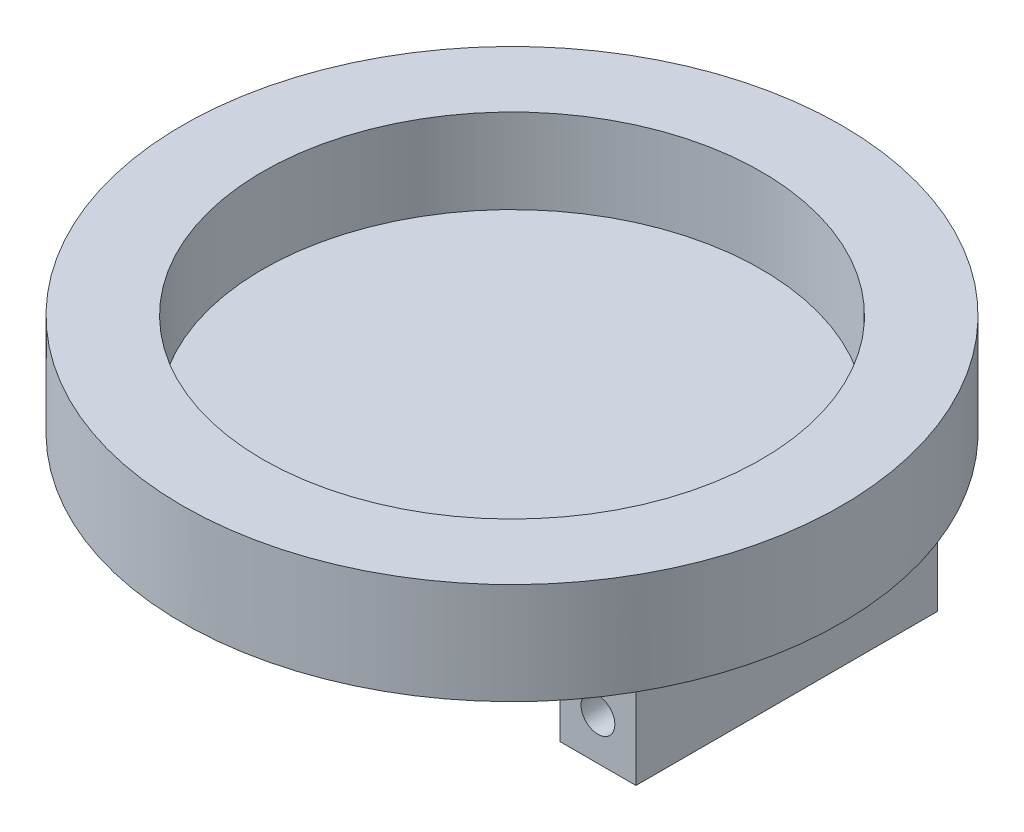
ISO-10303-21;
HEADER;
FILE_DESCRIPTION(('STEP AP214'),'2;1');
FILE_NAME('part.step','',(''),(''),'','','');
FILE_SCHEMA(('AUTOMOTIVE_DESIGN { 1 0 10303 214 1 1 1 1 }'));
ENDSEC;
DATA;
#1=APPLICATION_CONTEXT('core data for automotive mechanical design processes');
#2=APPLICATION_PROTOCOL_DEFINITION('international standard','automotive_design',2000,#1);
#3=PRODUCT_CONTEXT('',#1,'mechanical');
#4=PRODUCT('Part','Part','',(#3));
#5=PRODUCT_RELATED_PRODUCT_CATEGORY('part','',(#4));
#6=PRODUCT_DEFINITION_FORMATION('','',#4);
#7=PRODUCT_DEFINITION_CONTEXT('part definition',#1,'design');
#8=PRODUCT_DEFINITION('design','',#6,#7);
#9=PRODUCT_DEFINITION_SHAPE('','',#8);
#10=(LENGTH_UNIT() NAMED_UNIT(*) SI_UNIT(.MILLI.,.METRE.));
#11=(NAMED_UNIT(*) PLANE_ANGLE_UNIT() SI_UNIT($,.RADIAN.));
#12=(NAMED_UNIT(*) SI_UNIT($,.STERADIAN.) SOLID_ANGLE_UNIT());
#13=UNCERTAINTY_MEASURE_WITH_UNIT(LENGTH_MEASURE(1.E-05),#10,'distance_accuracy_value','');
#14=(GEOMETRIC_REPRESENTATION_CONTEXT(3) GLOBAL_UNCERTAINTY_ASSIGNED_CONTEXT((#13)) GLOBAL_UNIT_ASSIGNED_CONTEXT((#10,
#11,#12)) REPRESENTATION_CONTEXT('',''));
#15=CARTESIAN_POINT('',(0.,0.,0.));
#16=DIRECTION('',(0.,0.,1.));
#17=DIRECTION('',(1.,0.,0.));
#18=AXIS2_PLACEMENT_3D('',#15,#16,#17);
#19=CARTESIAN_POINT('',(0.,63.5,0.));
#20=DIRECTION('',(0.,1.,0.));
#21=DIRECTION('',(0.,0.,1.));
#22=AXIS2_PLACEMENT_3D('',#19,#20,#21);
#23=PLANE('',#22);
#24=CARTESIAN_POINT('',(0.,63.5,0.));
#25=DIRECTION('',(0.,1.,0.));
#26=DIRECTION('',(0.,0.,1.));
#27=AXIS2_PLACEMENT_3D('',#24,#25,#26);
#28=CIRCLE('',#27,247.65);
#29=CARTESIAN_POINT('',(0.,63.5,247.65));
#30=VERTEX_POINT('',#29);
#31=EDGE_CURVE('E11',#30,#30,#28,.T.);
#32=ORIENTED_EDGE('',*,*,#31,.T.);
#33=EDGE_LOOP('',(#32));
#34=FACE_BOUND('',#33,.T.);
#35=CARTESIAN_POINT('',(0.,63.5,0.));
#36=DIRECTION('',(0.,1.,0.));
#37=DIRECTION('',(0.,0.,1.));
#38=AXIS2_PLACEMENT_3D('',#35,#36,#37);
#39=CIRCLE('',#38,187.325);
#40=CARTESIAN_POINT('',(0.,63.5,187.325));
#41=VERTEX_POINT('',#40);
#42=EDGE_CURVE('E52',#41,#41,#39,.T.);
#43=ORIENTED_EDGE('',*,*,#42,.F.);
#44=EDGE_LOOP('',(#43));
#45=FACE_BOUND('',#44,.T.);
#46=ADVANCED_FACE('F43',(#34,#45),#23,.T.);
#47=CARTESIAN_POINT('',(0.,63.5,0.));
#48=DIRECTION('',(0.,-1.,0.));
#49=DIRECTION('',(0.,0.,-1.));
#50=AXIS2_PLACEMENT_3D('',#47,#48,#49);
#51=CYLINDRICAL_SURFACE('',#50,247.65);
#52=ORIENTED_EDGE('',*,*,#31,.F.);
#53=EDGE_LOOP('',(#52));
#54=FACE_BOUND('',#53,.T.);
#55=CARTESIAN_POINT('',(0.,-12.7,0.));
#56=DIRECTION('',(0.,-1.,0.));
#57=DIRECTION('',(0.,0.,-1.));
#58=AXIS2_PLACEMENT_3D('',#55,#56,#57);
#59=CIRCLE('',#58,247.65);
#60=CARTESIAN_POINT('',(0.,-12.7,-247.65));
#61=VERTEX_POINT('',#60);
#62=EDGE_CURVE('E194',#61,#61,#59,.T.);
#63=ORIENTED_EDGE('',*,*,#62,.F.);
#64=EDGE_LOOP('',(#63));
#65=FACE_BOUND('',#64,.T.);
#66=ADVANCED_FACE('F45',(#54,#65),#51,.T.);
#67=CARTESIAN_POINT('',(0.,63.5,0.));
#68=DIRECTION('',(0.,-1.,0.));
#69=DIRECTION('',(0.,0.,-1.));
#70=AXIS2_PLACEMENT_3D('',#67,#68,#69);
#71=CYLINDRICAL_SURFACE('',#70,187.325);
#72=ORIENTED_EDGE('',*,*,#42,.T.);
#73=EDGE_LOOP('',(#72));
#74=FACE_BOUND('',#73,.T.);
#75=CARTESIAN_POINT('',(0.,0.,0.));
#76=DIRECTION('',(0.,1.,0.));
#77=DIRECTION('',(0.,0.,1.));
#78=AXIS2_PLACEMENT_3D('',#75,#76,#77);
#79=CIRCLE('',#78,187.325);
#80=CARTESIAN_POINT('',(0.,0.,187.325));
#81=VERTEX_POINT('',#80);
#82=EDGE_CURVE('E209',#81,#81,#79,.T.);
#83=ORIENTED_EDGE('',*,*,#82,.F.);
#84=EDGE_LOOP('',(#83));
#85=FACE_BOUND('',#84,.T.);
#86=ADVANCED_FACE('F218',(#74,#85),#71,.F.);
#87=CARTESIAN_POINT('',(0.,0.,0.));
#88=DIRECTION('',(0.,-1.,0.));
#89=DIRECTION('',(0.,0.,-1.));
#90=AXIS2_PLACEMENT_3D('',#87,#88,#89);
#91=PLANE('',#90);
#92=ORIENTED_EDGE('',*,*,#82,.T.);
#93=EDGE_LOOP('',(#92));
#94=FACE_BOUND('',#93,.T.);
#95=ADVANCED_FACE('F216',(#94),#91,.F.);
#96=CARTESIAN_POINT('',(0.,-12.7,0.));
#97=DIRECTION('',(0.,-1.,0.));
#98=DIRECTION('',(0.,0.,-1.));
#99=AXIS2_PLACEMENT_3D('',#96,#97,#98);
#100=PLANE('',#99);
#101=DIRECTION('',(-1.,0.,0.));
#102=VECTOR('',#101,1.);
#103=CARTESIAN_POINT('',(0.,-12.7,-113.236721075806));
#104=LINE('',#103,#102);
#105=CARTESIAN_POINT('',(206.375,-12.7,-113.236721075806));
#106=VERTEX_POINT('',#105);
#107=CARTESIAN_POINT('',(149.225,-12.7,-113.236721075806));
#108=VERTEX_POINT('',#107);
#109=EDGE_CURVE('E145',#106,#108,#104,.T.);
#110=ORIENTED_EDGE('',*,*,#109,.T.);
#111=DIRECTION('',(0.,0.,1.));
#112=VECTOR('',#111,1.);
#113=CARTESIAN_POINT('',(149.225,-12.7,0.));
#114=LINE('',#113,#112);
#115=CARTESIAN_POINT('',(149.225,-12.7,113.236721075806));
#116=VERTEX_POINT('',#115);
#117=EDGE_CURVE('E113',#108,#116,#114,.T.);
#118=ORIENTED_EDGE('',*,*,#117,.T.);
#119=DIRECTION('',(-1.,0.,0.));
#120=VECTOR('',#119,1.);
#121=CARTESIAN_POINT('',(0.,-12.7,113.236721075806));
#122=LINE('',#121,#120);
#123=CARTESIAN_POINT('',(206.375,-12.7,113.236721075806));
#124=VERTEX_POINT('',#123);
#125=EDGE_CURVE('E64',#124,#116,#122,.T.);
#126=ORIENTED_EDGE('',*,*,#125,.F.);
#127=DIRECTION('',(0.,0.,1.));
#128=VECTOR('',#127,1.);
#129=CARTESIAN_POINT('',(206.375,-12.7,0.));
#130=LINE('',#129,#128);
#131=EDGE_CURVE('E59',#106,#124,#130,.T.);
#132=ORIENTED_EDGE('',*,*,#131,.F.);
#133=EDGE_LOOP('',(#110,#118,#126,#132));
#134=FACE_BOUND('',#133,.T.);
#135=DIRECTION('',(-1.,0.,0.));
#136=VECTOR('',#135,1.);
#137=CARTESIAN_POINT('',(0.,-12.7,-113.236721075807));
#138=LINE('',#137,#136);
#139=CARTESIAN_POINT('',(-149.225,-12.7,-113.236721075807));
#140=VERTEX_POINT('',#139);
#141=CARTESIAN_POINT('',(-206.375,-12.7,-113.236721075807));
#142=VERTEX_POINT('',#141);
#143=EDGE_CURVE('E155',#140,#142,#138,.T.);
#144=ORIENTED_EDGE('',*,*,#143,.T.);
#145=DIRECTION('',(0.,0.,1.));
#146=VECTOR('',#145,1.);
#147=CARTESIAN_POINT('',(-206.375,-12.7,0.));
#148=LINE('',#147,#146);
#149=CARTESIAN_POINT('',(-206.375,-12.7,113.236721075806));
#150=VERTEX_POINT('',#149);
#151=EDGE_CURVE('E180',#142,#150,#148,.T.);
#152=ORIENTED_EDGE('',*,*,#151,.T.);
#153=DIRECTION('',(-1.,0.,0.));
#154=VECTOR('',#153,1.);
#155=CARTESIAN_POINT('',(0.,-12.7,113.236721075806));
#156=LINE('',#155,#154);
#157=CARTESIAN_POINT('',(-149.225,-12.7,113.236721075806));
#158=VERTEX_POINT('',#157);
#159=EDGE_CURVE('E183',#158,#150,#156,.T.);
#160=ORIENTED_EDGE('',*,*,#159,.F.);
#161=DIRECTION('',(0.,0.,1.));
#162=VECTOR('',#161,1.);
#163=CARTESIAN_POINT('',(-149.225,-12.7,0.));
#164=LINE('',#163,#162);
#165=EDGE_CURVE('E167',#140,#158,#164,.T.);
#166=ORIENTED_EDGE('',*,*,#165,.F.);
#167=EDGE_LOOP('',(#144,#152,#160,#166));
#168=FACE_BOUND('',#167,.T.);
#169=ORIENTED_EDGE('',*,*,#62,.T.);
#170=EDGE_LOOP('',(#169));
#171=FACE_BOUND('',#170,.T.);
#172=ADVANCED_FACE('F226',(#134,#168,#171),#100,.T.);
#173=CARTESIAN_POINT('',(0.,-82.55,-113.236721075807));
#174=DIRECTION('',(0.,0.,-1.));
#175=DIRECTION('',(-1.,0.,0.));
#176=AXIS2_PLACEMENT_3D('',#173,#174,#175);
#177=PLANE('',#176);
#178=CARTESIAN_POINT('',(-177.8,-50.8,-113.236721075807));
#179=DIRECTION('',(0.,0.,-1.));
#180=DIRECTION('',(-1.,0.,0.));
#181=AXIS2_PLACEMENT_3D('',#178,#179,#180);
#182=CIRCLE('',#181,12.7);
#183=CARTESIAN_POINT('',(-190.5,-50.8,-113.236721075807));
#184=VERTEX_POINT('',#183);
#185=EDGE_CURVE('E298',#184,#184,#182,.F.);
#186=ORIENTED_EDGE('',*,*,#185,.T.);
#187=EDGE_LOOP('',(#186));
#188=FACE_BOUND('',#187,.T.);
#189=ORIENTED_EDGE('',*,*,#143,.F.);
#190=DIRECTION('',(0.,1.,0.));
#191=VECTOR('',#190,1.);
#192=CARTESIAN_POINT('',(-149.225,-82.55,-113.236721075807));
#193=LINE('',#192,#191);
#194=CARTESIAN_POINT('',(-149.225,-82.55,-113.236721075807));
#195=VERTEX_POINT('',#194);
#196=EDGE_CURVE('E190',#195,#140,#193,.T.);
#197=ORIENTED_EDGE('',*,*,#196,.F.);
#198=DIRECTION('',(-1.,0.,0.));
#199=VECTOR('',#198,1.);
#200=CARTESIAN_POINT('',(0.,-82.55,-113.236721075807));
#201=LINE('',#200,#199);
#202=CARTESIAN_POINT('',(-206.375,-82.55,-113.236721075807));
#203=VERTEX_POINT('',#202);
#204=EDGE_CURVE('E162',#195,#203,#201,.T.);
#205=ORIENTED_EDGE('',*,*,#204,.T.);
#206=DIRECTION('',(0.,1.,0.));
#207=VECTOR('',#206,1.);
#208=CARTESIAN_POINT('',(-206.375,-82.55,-113.236721075807));
#209=LINE('',#208,#207);
#210=EDGE_CURVE('E177',#203,#142,#209,.T.);
#211=ORIENTED_EDGE('',*,*,#210,.T.);
#212=EDGE_LOOP('',(#189,#197,#205,#211));
#213=FACE_BOUND('',#212,.T.);
#214=ADVANCED_FACE('F240',(#188,#213),#177,.T.);
#215=CARTESIAN_POINT('',(-149.225,-82.55,0.));
#216=DIRECTION('',(-1.,0.,0.));
#217=DIRECTION('',(0.,0.,1.));
#218=AXIS2_PLACEMENT_3D('',#215,#216,#217);
#219=PLANE('',#218);
#220=ORIENTED_EDGE('',*,*,#165,.T.);
#221=DIRECTION('',(0.,1.,0.));
#222=VECTOR('',#221,1.);
#223=CARTESIAN_POINT('',(-149.225,-82.55,113.236721075806));
#224=LINE('',#223,#222);
#225=CARTESIAN_POINT('',(-149.225,-82.55,113.236721075806));
#226=VERTEX_POINT('',#225);
#227=EDGE_CURVE('E195',#226,#158,#224,.T.);
#228=ORIENTED_EDGE('',*,*,#227,.F.);
#229=DIRECTION('',(0.,0.,1.));
#230=VECTOR('',#229,1.);
#231=CARTESIAN_POINT('',(-149.225,-82.55,0.));
#232=LINE('',#231,#230);
#233=EDGE_CURVE('E174',#195,#226,#232,.T.);
#234=ORIENTED_EDGE('',*,*,#233,.F.);
#235=ORIENTED_EDGE('',*,*,#196,.T.);
#236=EDGE_LOOP('',(#220,#228,#234,#235));
#237=FACE_BOUND('',#236,.T.);
#238=ADVANCED_FACE('F245',(#237),#219,.F.);
#239=CARTESIAN_POINT('',(0.,-82.55,113.236721075806));
#240=DIRECTION('',(0.,0.,-1.));
#241=DIRECTION('',(-1.,0.,0.));
#242=AXIS2_PLACEMENT_3D('',#239,#240,#241);
#243=PLANE('',#242);
#244=CARTESIAN_POINT('',(-177.8,-50.8,113.236721075806));
#245=DIRECTION('',(0.,0.,1.));
#246=DIRECTION('',(1.,0.,0.));
#247=AXIS2_PLACEMENT_3D('',#244,#245,#246);
#248=CIRCLE('',#247,12.7);
#249=CARTESIAN_POINT('',(-165.1,-50.8,113.236721075806));
#250=VERTEX_POINT('',#249);
#251=EDGE_CURVE('E138',#250,#250,#248,.T.);
#252=ORIENTED_EDGE('',*,*,#251,.F.);
#253=EDGE_LOOP('',(#252));
#254=FACE_BOUND('',#253,.T.);
#255=ORIENTED_EDGE('',*,*,#159,.T.);
#256=DIRECTION('',(0.,1.,0.));
#257=VECTOR('',#256,1.);
#258=CARTESIAN_POINT('',(-206.375,-82.55,113.236721075806));
#259=LINE('',#258,#257);
#260=CARTESIAN_POINT('',(-206.375,-82.55,113.236721075806));
#261=VERTEX_POINT('',#260);
#262=EDGE_CURVE('E199',#261,#150,#259,.T.);
#263=ORIENTED_EDGE('',*,*,#262,.F.);
#264=DIRECTION('',(-1.,0.,0.));
#265=VECTOR('',#264,1.);
#266=CARTESIAN_POINT('',(0.,-82.55,113.236721075806));
#267=LINE('',#266,#265);
#268=EDGE_CURVE('E171',#226,#261,#267,.T.);
#269=ORIENTED_EDGE('',*,*,#268,.F.);
#270=ORIENTED_EDGE('',*,*,#227,.T.);
#271=EDGE_LOOP('',(#255,#263,#269,#270));
#272=FACE_BOUND('',#271,.T.);
#273=ADVANCED_FACE('F254',(#254,#272),#243,.F.);
#274=CARTESIAN_POINT('',(-206.375,-82.55,0.));
#275=DIRECTION('',(-1.,0.,0.));
#276=DIRECTION('',(0.,0.,1.));
#277=AXIS2_PLACEMENT_3D('',#274,#275,#276);
#278=PLANE('',#277);
#279=ORIENTED_EDGE('',*,*,#151,.F.);
#280=ORIENTED_EDGE('',*,*,#210,.F.);
#281=DIRECTION('',(0.,0.,1.));
#282=VECTOR('',#281,1.);
#283=CARTESIAN_POINT('',(-206.375,-82.55,0.));
#284=LINE('',#283,#282);
#285=EDGE_CURVE('E166',#203,#261,#284,.T.);
#286=ORIENTED_EDGE('',*,*,#285,.T.);
#287=ORIENTED_EDGE('',*,*,#262,.T.);
#288=EDGE_LOOP('',(#279,#280,#286,#287));
#289=FACE_BOUND('',#288,.T.);
#290=ADVANCED_FACE('F250',(#289),#278,.T.);
#291=CARTESIAN_POINT('',(0.,-82.55,0.));
#292=DIRECTION('',(0.,1.,0.));
#293=DIRECTION('',(0.,0.,1.));
#294=AXIS2_PLACEMENT_3D('',#291,#292,#293);
#295=PLANE('',#294);
#296=ORIENTED_EDGE('',*,*,#204,.F.);
#297=ORIENTED_EDGE('',*,*,#233,.T.);
#298=ORIENTED_EDGE('',*,*,#268,.T.);
#299=ORIENTED_EDGE('',*,*,#285,.F.);
#300=EDGE_LOOP('',(#296,#297,#298,#299));
#301=FACE_BOUND('',#300,.T.);
#302=ADVANCED_FACE('F253',(#301),#295,.F.);
#303=CARTESIAN_POINT('',(0.,-82.55,-113.236721075806));
#304=DIRECTION('',(0.,0.,-1.));
#305=DIRECTION('',(-1.,0.,0.));
#306=AXIS2_PLACEMENT_3D('',#303,#304,#305);
#307=PLANE('',#306);
#308=CARTESIAN_POINT('',(177.8,-50.8,-113.236721075806));
#309=DIRECTION('',(0.,0.,-1.));
#310=DIRECTION('',(-1.,0.,0.));
#311=AXIS2_PLACEMENT_3D('',#308,#309,#310);
#312=CIRCLE('',#311,12.7);
#313=CARTESIAN_POINT('',(165.1,-50.8,-113.236721075806));
#314=VERTEX_POINT('',#313);
#315=EDGE_CURVE('E292',#314,#314,#312,.F.);
#316=ORIENTED_EDGE('',*,*,#315,.T.);
#317=EDGE_LOOP('',(#316));
#318=FACE_BOUND('',#317,.T.);
#319=ORIENTED_EDGE('',*,*,#109,.F.);
#320=DIRECTION('',(0.,1.,0.));
#321=VECTOR('',#320,1.);
#322=CARTESIAN_POINT('',(206.375,-82.55,-113.236721075806));
#323=LINE('',#322,#321);
#324=CARTESIAN_POINT('',(206.375,-82.55,-113.236721075806));
#325=VERTEX_POINT('',#324);
#326=EDGE_CURVE('E131',#325,#106,#323,.T.);
#327=ORIENTED_EDGE('',*,*,#326,.F.);
#328=DIRECTION('',(-1.,0.,0.));
#329=VECTOR('',#328,1.);
#330=CARTESIAN_POINT('',(0.,-82.55,-113.236721075806));
#331=LINE('',#330,#329);
#332=CARTESIAN_POINT('',(149.225,-82.55,-113.236721075806));
#333=VERTEX_POINT('',#332);
#334=EDGE_CURVE('E124',#325,#333,#331,.T.);
#335=ORIENTED_EDGE('',*,*,#334,.T.);
#336=DIRECTION('',(0.,1.,0.));
#337=VECTOR('',#336,1.);
#338=CARTESIAN_POINT('',(149.225,-82.55,-113.236721075806));
#339=LINE('',#338,#337);
#340=EDGE_CURVE('E108',#333,#108,#339,.T.);
#341=ORIENTED_EDGE('',*,*,#340,.T.);
#342=EDGE_LOOP('',(#319,#327,#335,#341));
#343=FACE_BOUND('',#342,.T.);
#344=ADVANCED_FACE('F130',(#318,#343),#307,.T.);
#345=CARTESIAN_POINT('',(206.375,-82.55,0.));
#346=DIRECTION('',(-1.,0.,0.));
#347=DIRECTION('',(0.,0.,1.));
#348=AXIS2_PLACEMENT_3D('',#345,#346,#347);
#349=PLANE('',#348);
#350=ORIENTED_EDGE('',*,*,#131,.T.);
#351=DIRECTION('',(0.,1.,0.));
#352=VECTOR('',#351,1.);
#353=CARTESIAN_POINT('',(206.375,-82.55,113.236721075806));
#354=LINE('',#353,#352);
#355=CARTESIAN_POINT('',(206.375,-82.55,113.236721075806));
#356=VERTEX_POINT('',#355);
#357=EDGE_CURVE('E156',#356,#124,#354,.T.);
#358=ORIENTED_EDGE('',*,*,#357,.F.);
#359=DIRECTION('',(0.,0.,1.));
#360=VECTOR('',#359,1.);
#361=CARTESIAN_POINT('',(206.375,-82.55,0.));
#362=LINE('',#361,#360);
#363=EDGE_CURVE('E119',#325,#356,#362,.T.);
#364=ORIENTED_EDGE('',*,*,#363,.F.);
#365=ORIENTED_EDGE('',*,*,#326,.T.);
#366=EDGE_LOOP('',(#350,#358,#364,#365));
#367=FACE_BOUND('',#366,.T.);
#368=ADVANCED_FACE('F267',(#367),#349,.F.);
#369=CARTESIAN_POINT('',(0.,-82.55,113.236721075806));
#370=DIRECTION('',(0.,0.,-1.));
#371=DIRECTION('',(-1.,0.,0.));
#372=AXIS2_PLACEMENT_3D('',#369,#370,#371);
#373=PLANE('',#372);
#374=CARTESIAN_POINT('',(177.8,-50.8,113.236721075806));
#375=DIRECTION('',(0.,0.,1.));
#376=DIRECTION('',(1.,0.,0.));
#377=AXIS2_PLACEMENT_3D('',#374,#375,#376);
#378=CIRCLE('',#377,12.7);
#379=CARTESIAN_POINT('',(190.5,-50.8,113.236721075806));
#380=VERTEX_POINT('',#379);
#381=EDGE_CURVE('E148',#380,#380,#378,.T.);
#382=ORIENTED_EDGE('',*,*,#381,.F.);
#383=EDGE_LOOP('',(#382));
#384=FACE_BOUND('',#383,.T.);
#385=ORIENTED_EDGE('',*,*,#125,.T.);
#386=DIRECTION('',(0.,1.,0.));
#387=VECTOR('',#386,1.);
#388=CARTESIAN_POINT('',(149.225,-82.55,113.236721075806));
#389=LINE('',#388,#387);
#390=CARTESIAN_POINT('',(149.225,-82.55,113.236721075806));
#391=VERTEX_POINT('',#390);
#392=EDGE_CURVE('E118',#391,#116,#389,.T.);
#393=ORIENTED_EDGE('',*,*,#392,.F.);
#394=DIRECTION('',(-1.,0.,0.));
#395=VECTOR('',#394,1.);
#396=CARTESIAN_POINT('',(0.,-82.55,113.236721075806));
#397=LINE('',#396,#395);
#398=EDGE_CURVE('E126',#356,#391,#397,.T.);
#399=ORIENTED_EDGE('',*,*,#398,.F.);
#400=ORIENTED_EDGE('',*,*,#357,.T.);
#401=EDGE_LOOP('',(#385,#393,#399,#400));
#402=FACE_BOUND('',#401,.T.);
#403=ADVANCED_FACE('F271',(#384,#402),#373,.F.);
#404=CARTESIAN_POINT('',(149.225,-82.55,0.));
#405=DIRECTION('',(-1.,0.,0.));
#406=DIRECTION('',(0.,0.,1.));
#407=AXIS2_PLACEMENT_3D('',#404,#405,#406);
#408=PLANE('',#407);
#409=ORIENTED_EDGE('',*,*,#117,.F.);
#410=ORIENTED_EDGE('',*,*,#340,.F.);
#411=DIRECTION('',(0.,0.,1.));
#412=VECTOR('',#411,1.);
#413=CARTESIAN_POINT('',(149.225,-82.55,0.));
#414=LINE('',#413,#412);
#415=EDGE_CURVE('E112',#333,#391,#414,.T.);
#416=ORIENTED_EDGE('',*,*,#415,.T.);
#417=ORIENTED_EDGE('',*,*,#392,.T.);
#418=EDGE_LOOP('',(#409,#410,#416,#417));
#419=FACE_BOUND('',#418,.T.);
#420=ADVANCED_FACE('F110',(#419),#408,.T.);
#421=CARTESIAN_POINT('',(0.,-82.55,0.));
#422=DIRECTION('',(0.,1.,0.));
#423=DIRECTION('',(0.,0.,1.));
#424=AXIS2_PLACEMENT_3D('',#421,#422,#423);
#425=PLANE('',#424);
#426=ORIENTED_EDGE('',*,*,#334,.F.);
#427=ORIENTED_EDGE('',*,*,#363,.T.);
#428=ORIENTED_EDGE('',*,*,#398,.T.);
#429=ORIENTED_EDGE('',*,*,#415,.F.);
#430=EDGE_LOOP('',(#426,#427,#428,#429));
#431=FACE_BOUND('',#430,.T.);
#432=ADVANCED_FACE('F123',(#431),#425,.F.);
#433=CARTESIAN_POINT('',(177.8,-50.8,-247.651));
#434=DIRECTION('',(0.,0.,1.));
#435=DIRECTION('',(1.,0.,0.));
#436=AXIS2_PLACEMENT_3D('',#433,#434,#435);
#437=CYLINDRICAL_SURFACE('',#436,12.7);
#438=ORIENTED_EDGE('',*,*,#315,.F.);
#439=EDGE_LOOP('',(#438));
#440=FACE_BOUND('',#439,.T.);
#441=ORIENTED_EDGE('',*,*,#381,.T.);
#442=EDGE_LOOP('',(#441));
#443=FACE_BOUND('',#442,.T.);
#444=ADVANCED_FACE('F280',(#440,#443),#437,.F.);
#445=CARTESIAN_POINT('',(-177.8,-50.8,-247.651));
#446=DIRECTION('',(0.,0.,1.));
#447=DIRECTION('',(1.,0.,0.));
#448=AXIS2_PLACEMENT_3D('',#445,#446,#447);
#449=CYLINDRICAL_SURFACE('',#448,12.7);
#450=ORIENTED_EDGE('',*,*,#185,.F.);
#451=EDGE_LOOP('',(#450));
#452=FACE_BOUND('',#451,.T.);
#453=ORIENTED_EDGE('',*,*,#251,.T.);
#454=EDGE_LOOP('',(#453));
#455=FACE_BOUND('',#454,.T.);
#456=ADVANCED_FACE('F281',(#452,#455),#449,.F.);
#457=CLOSED_SHELL('',(#46,#66,#86,#95,#172,#214,#238,#273,#290,#302,#344,#368,#403,#420,#432,
#444,#456));
#458=MANIFOLD_SOLID_BREP('B2',#457);
#459=ADVANCED_BREP_SHAPE_REPRESENTATION('',(#18,#458),#14);
#460=SHAPE_DEFINITION_REPRESENTATION(#9,#459);
ENDSEC;
END-ISO-10303-21;
